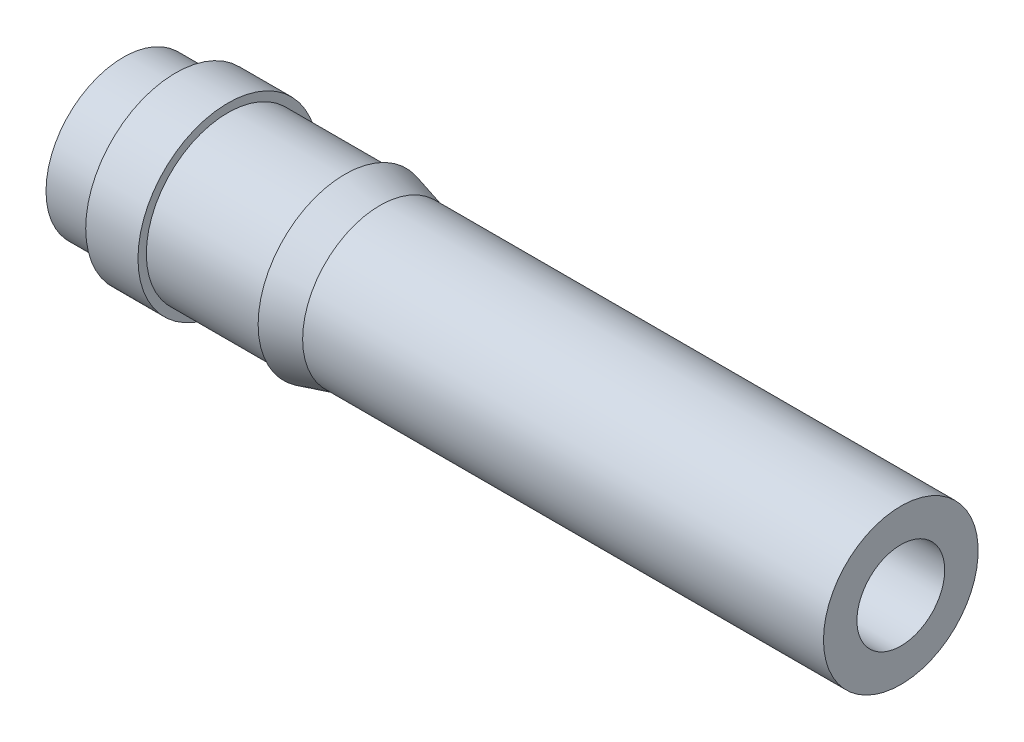
ISO-10303-21;
HEADER;
FILE_DESCRIPTION(('STEP AP214'),'2;1');
FILE_NAME('part.step','',(''),(''),'','','');
FILE_SCHEMA(('AUTOMOTIVE_DESIGN { 1 0 10303 214 1 1 1 1 }'));
ENDSEC;
DATA;
#1=APPLICATION_CONTEXT('core data for automotive mechanical design processes');
#2=APPLICATION_PROTOCOL_DEFINITION('international standard','automotive_design',2000,#1);
#3=PRODUCT_CONTEXT('',#1,'mechanical');
#4=PRODUCT('Part','Part','',(#3));
#5=PRODUCT_RELATED_PRODUCT_CATEGORY('part','',(#4));
#6=PRODUCT_DEFINITION_FORMATION('','',#4);
#7=PRODUCT_DEFINITION_CONTEXT('part definition',#1,'design');
#8=PRODUCT_DEFINITION('design','',#6,#7);
#9=PRODUCT_DEFINITION_SHAPE('','',#8);
#10=(LENGTH_UNIT() NAMED_UNIT(*) SI_UNIT(.MILLI.,.METRE.));
#11=(NAMED_UNIT(*) PLANE_ANGLE_UNIT() SI_UNIT($,.RADIAN.));
#12=(NAMED_UNIT(*) SI_UNIT($,.STERADIAN.) SOLID_ANGLE_UNIT());
#13=UNCERTAINTY_MEASURE_WITH_UNIT(LENGTH_MEASURE(1.E-05),#10,'distance_accuracy_value','');
#14=(GEOMETRIC_REPRESENTATION_CONTEXT(3) GLOBAL_UNCERTAINTY_ASSIGNED_CONTEXT((#13)) GLOBAL_UNIT_ASSIGNED_CONTEXT((#10,
#11,#12)) REPRESENTATION_CONTEXT('',''));
#15=CARTESIAN_POINT('',(0.,0.,0.));
#16=DIRECTION('',(0.,0.,1.));
#17=DIRECTION('',(1.,0.,0.));
#18=AXIS2_PLACEMENT_3D('',#15,#16,#17);
#19=CARTESIAN_POINT('',(0.,0.,0.));
#20=DIRECTION('',(1.,0.,0.));
#21=DIRECTION('',(0.,0.,-1.));
#22=AXIS2_PLACEMENT_3D('',#19,#20,#21);
#23=PLANE('',#22);
#24=CARTESIAN_POINT('',(0.,0.,0.));
#25=DIRECTION('',(-1.,0.,0.));
#26=DIRECTION('',(0.,0.,1.));
#27=AXIS2_PLACEMENT_3D('',#24,#25,#26);
#28=CIRCLE('',#27,0.35052);
#29=CARTESIAN_POINT('',(0.,0.,0.35052));
#30=VERTEX_POINT('',#29);
#31=EDGE_CURVE('E70',#30,#30,#28,.T.);
#32=ORIENTED_EDGE('',*,*,#31,.F.);
#33=EDGE_LOOP('',(#32));
#34=FACE_BOUND('',#33,.T.);
#35=CARTESIAN_POINT('',(0.,0.,0.));
#36=DIRECTION('',(-1.,0.,0.));
#37=DIRECTION('',(0.,0.,1.));
#38=AXIS2_PLACEMENT_3D('',#35,#36,#37);
#39=CIRCLE('',#38,0.469899999999995);
#40=CARTESIAN_POINT('',(0.,0.,0.469899999999995));
#41=VERTEX_POINT('',#40);
#42=EDGE_CURVE('E10',#41,#41,#39,.T.);
#43=ORIENTED_EDGE('',*,*,#42,.T.);
#44=EDGE_LOOP('',(#43));
#45=FACE_BOUND('',#44,.T.);
#46=ADVANCED_FACE('F33',(#34,#45),#23,.F.);
#47=CARTESIAN_POINT('',(0.,0.,0.));
#48=DIRECTION('',(-1.,0.,0.));
#49=DIRECTION('',(0.,0.,1.));
#50=AXIS2_PLACEMENT_3D('',#47,#48,#49);
#51=CYLINDRICAL_SURFACE('',#50,0.469899999999995);
#52=ORIENTED_EDGE('',*,*,#42,.F.);
#53=EDGE_LOOP('',(#52));
#54=FACE_BOUND('',#53,.T.);
#55=CARTESIAN_POINT('',(0.317499999999981,0.,0.));
#56=DIRECTION('',(-1.,0.,0.));
#57=DIRECTION('',(0.,0.,1.));
#58=AXIS2_PLACEMENT_3D('',#55,#56,#57);
#59=CIRCLE('',#58,0.469899999999995);
#60=CARTESIAN_POINT('',(0.317499999999981,0.,0.469899999999995));
#61=VERTEX_POINT('',#60);
#62=EDGE_CURVE('E39',#61,#61,#59,.T.);
#63=ORIENTED_EDGE('',*,*,#62,.T.);
#64=EDGE_LOOP('',(#63));
#65=FACE_BOUND('',#64,.T.);
#66=ADVANCED_FACE('F103',(#54,#65),#51,.T.);
#67=CARTESIAN_POINT('',(0.317500000000001,0.546099999999994,0.));
#68=DIRECTION('',(1.,0.,0.));
#69=DIRECTION('',(0.,0.,-1.));
#70=AXIS2_PLACEMENT_3D('',#67,#68,#69);
#71=PLANE('',#70);
#72=ORIENTED_EDGE('',*,*,#62,.F.);
#73=EDGE_LOOP('',(#72));
#74=FACE_BOUND('',#73,.T.);
#75=CARTESIAN_POINT('',(0.317500000000021,0.,0.));
#76=DIRECTION('',(-1.,0.,0.));
#77=DIRECTION('',(0.,0.,1.));
#78=AXIS2_PLACEMENT_3D('',#75,#76,#77);
#79=CIRCLE('',#78,0.546099999999994);
#80=CARTESIAN_POINT('',(0.317500000000021,0.,0.546099999999994));
#81=VERTEX_POINT('',#80);
#82=EDGE_CURVE('E43',#81,#81,#79,.T.);
#83=ORIENTED_EDGE('',*,*,#82,.T.);
#84=EDGE_LOOP('',(#83));
#85=FACE_BOUND('',#84,.T.);
#86=ADVANCED_FACE('F108',(#74,#85),#71,.F.);
#87=CARTESIAN_POINT('',(0.,0.,0.));
#88=DIRECTION('',(-1.,0.,0.));
#89=DIRECTION('',(0.,0.,1.));
#90=AXIS2_PLACEMENT_3D('',#87,#88,#89);
#91=CYLINDRICAL_SURFACE('',#90,0.546099999999993);
#92=ORIENTED_EDGE('',*,*,#82,.F.);
#93=EDGE_LOOP('',(#92));
#94=FACE_BOUND('',#93,.T.);
#95=CARTESIAN_POINT('',(0.635,0.,0.));
#96=DIRECTION('',(-1.,0.,0.));
#97=DIRECTION('',(0.,0.,1.));
#98=AXIS2_PLACEMENT_3D('',#95,#96,#97);
#99=CIRCLE('',#98,0.546099999999993);
#100=CARTESIAN_POINT('',(0.635,0.,0.546099999999993));
#101=VERTEX_POINT('',#100);
#102=EDGE_CURVE('E47',#101,#101,#99,.T.);
#103=ORIENTED_EDGE('',*,*,#102,.T.);
#104=EDGE_LOOP('',(#103));
#105=FACE_BOUND('',#104,.T.);
#106=ADVANCED_FACE('F182',(#94,#105),#91,.T.);
#107=CARTESIAN_POINT('',(0.635,0.546099999999993,0.));
#108=DIRECTION('',(-1.,0.,0.));
#109=DIRECTION('',(0.,0.,1.));
#110=AXIS2_PLACEMENT_3D('',#107,#108,#109);
#111=PLANE('',#110);
#112=ORIENTED_EDGE('',*,*,#102,.F.);
#113=EDGE_LOOP('',(#112));
#114=FACE_BOUND('',#113,.T.);
#115=CARTESIAN_POINT('',(0.635,0.,0.));
#116=DIRECTION('',(-1.,0.,0.));
#117=DIRECTION('',(0.,0.,1.));
#118=AXIS2_PLACEMENT_3D('',#115,#116,#117);
#119=CIRCLE('',#118,0.495299999999976);
#120=CARTESIAN_POINT('',(0.635,0.,0.495299999999976));
#121=VERTEX_POINT('',#120);
#122=EDGE_CURVE('E52',#121,#121,#119,.T.);
#123=ORIENTED_EDGE('',*,*,#122,.T.);
#124=EDGE_LOOP('',(#123));
#125=FACE_BOUND('',#124,.T.);
#126=ADVANCED_FACE('F172',(#114,#125),#111,.F.);
#127=CARTESIAN_POINT('',(0.,0.,0.));
#128=DIRECTION('',(-1.,0.,0.));
#129=DIRECTION('',(0.,0.,1.));
#130=AXIS2_PLACEMENT_3D('',#127,#128,#129);
#131=CYLINDRICAL_SURFACE('',#130,0.495299999999976);
#132=ORIENTED_EDGE('',*,*,#122,.F.);
#133=EDGE_LOOP('',(#132));
#134=FACE_BOUND('',#133,.T.);
#135=CARTESIAN_POINT('',(1.34619999999997,0.,0.));
#136=DIRECTION('',(-1.,0.,0.));
#137=DIRECTION('',(0.,0.,1.));
#138=AXIS2_PLACEMENT_3D('',#135,#136,#137);
#139=CIRCLE('',#138,0.495299999999976);
#140=CARTESIAN_POINT('',(1.34619999999997,0.,0.495299999999976));
#141=VERTEX_POINT('',#140);
#142=EDGE_CURVE('E55',#141,#141,#139,.T.);
#143=ORIENTED_EDGE('',*,*,#142,.T.);
#144=EDGE_LOOP('',(#143));
#145=FACE_BOUND('',#144,.T.);
#146=ADVANCED_FACE('F162',(#134,#145),#131,.T.);
#147=CARTESIAN_POINT('',(1.34619999999997,0.495299999999976,0.));
#148=DIRECTION('',(1.,0.,0.));
#149=DIRECTION('',(0.,0.,-1.));
#150=AXIS2_PLACEMENT_3D('',#147,#148,#149);
#151=PLANE('',#150);
#152=ORIENTED_EDGE('',*,*,#142,.F.);
#153=EDGE_LOOP('',(#152));
#154=FACE_BOUND('',#153,.T.);
#155=CARTESIAN_POINT('',(1.34619999999997,0.,0.));
#156=DIRECTION('',(-1.,0.,0.));
#157=DIRECTION('',(0.,0.,1.));
#158=AXIS2_PLACEMENT_3D('',#155,#156,#157);
#159=CIRCLE('',#158,0.527049999999958);
#160=CARTESIAN_POINT('',(1.34619999999997,0.,0.527049999999958));
#161=VERTEX_POINT('',#160);
#162=EDGE_CURVE('E58',#161,#161,#159,.T.);
#163=ORIENTED_EDGE('',*,*,#162,.T.);
#164=EDGE_LOOP('',(#163));
#165=FACE_BOUND('',#164,.T.);
#166=ADVANCED_FACE('F98',(#154,#165),#151,.F.);
#167=CARTESIAN_POINT('',(1.55948670365232,0.,0.));
#168=DIRECTION('',(-1.,0.,0.));
#169=DIRECTION('',(0.,0.,1.));
#170=AXIS2_PLACEMENT_3D('',#167,#168,#169);
#171=CONICAL_SURFACE('',#170,0.469899999999995,0.261799387799234);
#172=ORIENTED_EDGE('',*,*,#162,.F.);
#173=EDGE_LOOP('',(#172));
#174=FACE_BOUND('',#173,.T.);
#175=CARTESIAN_POINT('',(1.55948670365232,0.,0.));
#176=DIRECTION('',(-1.,0.,0.));
#177=DIRECTION('',(0.,0.,1.));
#178=AXIS2_PLACEMENT_3D('',#175,#176,#177);
#179=CIRCLE('',#178,0.469899999999995);
#180=CARTESIAN_POINT('',(1.55948670365232,0.,0.469899999999995));
#181=VERTEX_POINT('',#180);
#182=EDGE_CURVE('E61',#181,#181,#179,.T.);
#183=ORIENTED_EDGE('',*,*,#182,.T.);
#184=EDGE_LOOP('',(#183));
#185=FACE_BOUND('',#184,.T.);
#186=ADVANCED_FACE('F92',(#174,#185),#171,.T.);
#187=CARTESIAN_POINT('',(0.,0.,0.));
#188=DIRECTION('',(-1.,0.,0.));
#189=DIRECTION('',(0.,0.,1.));
#190=AXIS2_PLACEMENT_3D('',#187,#188,#189);
#191=CYLINDRICAL_SURFACE('',#190,0.469899999999995);
#192=ORIENTED_EDGE('',*,*,#182,.F.);
#193=EDGE_LOOP('',(#192));
#194=FACE_BOUND('',#193,.T.);
#195=CARTESIAN_POINT('',(4.7244,0.,0.));
#196=DIRECTION('',(-1.,0.,0.));
#197=DIRECTION('',(0.,0.,1.));
#198=AXIS2_PLACEMENT_3D('',#195,#196,#197);
#199=CIRCLE('',#198,0.469899999999995);
#200=CARTESIAN_POINT('',(4.7244,0.,0.469899999999995));
#201=VERTEX_POINT('',#200);
#202=EDGE_CURVE('E64',#201,#201,#199,.T.);
#203=ORIENTED_EDGE('',*,*,#202,.T.);
#204=EDGE_LOOP('',(#203));
#205=FACE_BOUND('',#204,.T.);
#206=ADVANCED_FACE('F87',(#194,#205),#191,.T.);
#207=CARTESIAN_POINT('',(4.7244,0.469899999999995,0.));
#208=DIRECTION('',(-1.,0.,0.));
#209=DIRECTION('',(0.,0.,1.));
#210=AXIS2_PLACEMENT_3D('',#207,#208,#209);
#211=PLANE('',#210);
#212=CARTESIAN_POINT('',(4.7244,0.,0.));
#213=DIRECTION('',(1.,0.,0.));
#214=DIRECTION('',(0.,0.,-1.));
#215=AXIS2_PLACEMENT_3D('',#212,#213,#214);
#216=CIRCLE('',#215,0.2667);
#217=CARTESIAN_POINT('',(4.7244,0.,-0.2667));
#218=VERTEX_POINT('',#217);
#219=EDGE_CURVE('E76',#218,#218,#216,.T.);
#220=ORIENTED_EDGE('',*,*,#219,.F.);
#221=EDGE_LOOP('',(#220));
#222=FACE_BOUND('',#221,.T.);
#223=ORIENTED_EDGE('',*,*,#202,.F.);
#224=EDGE_LOOP('',(#223));
#225=FACE_BOUND('',#224,.T.);
#226=ADVANCED_FACE('F83',(#222,#225),#211,.F.);
#227=CARTESIAN_POINT('',(3.937,0.,0.));
#228=DIRECTION('',(-1.,0.,0.));
#229=DIRECTION('',(0.,0.,1.));
#230=AXIS2_PLACEMENT_3D('',#227,#228,#229);
#231=CONICAL_SURFACE('',#230,0.350519999999999,1.02974425867666);
#232=CARTESIAN_POINT('',(3.98736413708689,0.,0.));
#233=DIRECTION('',(-1.,0.,0.));
#234=DIRECTION('',(0.,0.,1.));
#235=AXIS2_PLACEMENT_3D('',#232,#233,#234);
#236=CIRCLE('',#235,0.2667);
#237=CARTESIAN_POINT('',(3.98736413708689,0.,0.2667));
#238=VERTEX_POINT('',#237);
#239=EDGE_CURVE('E73',#238,#238,#236,.F.);
#240=ORIENTED_EDGE('',*,*,#239,.T.);
#241=EDGE_LOOP('',(#240));
#242=FACE_BOUND('',#241,.T.);
#243=CARTESIAN_POINT('',(3.937,0.,0.));
#244=DIRECTION('',(-1.,0.,0.));
#245=DIRECTION('',(0.,0.,1.));
#246=AXIS2_PLACEMENT_3D('',#243,#244,#245);
#247=CIRCLE('',#246,0.350519999999999);
#248=CARTESIAN_POINT('',(3.937,0.,0.350519999999999));
#249=VERTEX_POINT('',#248);
#250=EDGE_CURVE('E67',#249,#249,#247,.T.);
#251=ORIENTED_EDGE('',*,*,#250,.T.);
#252=EDGE_LOOP('',(#251));
#253=FACE_BOUND('',#252,.T.);
#254=ADVANCED_FACE('F86',(#242,#253),#231,.F.);
#255=CARTESIAN_POINT('',(0.,0.,0.));
#256=DIRECTION('',(-1.,0.,0.));
#257=DIRECTION('',(0.,0.,1.));
#258=AXIS2_PLACEMENT_3D('',#255,#256,#257);
#259=CYLINDRICAL_SURFACE('',#258,0.35052);
#260=ORIENTED_EDGE('',*,*,#250,.F.);
#261=EDGE_LOOP('',(#260));
#262=FACE_BOUND('',#261,.T.);
#263=ORIENTED_EDGE('',*,*,#31,.T.);
#264=EDGE_LOOP('',(#263));
#265=FACE_BOUND('',#264,.T.);
#266=ADVANCED_FACE('F112',(#262,#265),#259,.F.);
#267=CARTESIAN_POINT('',(4.7244,0.,0.));
#268=DIRECTION('',(1.,0.,0.));
#269=DIRECTION('',(0.,0.,-1.));
#270=AXIS2_PLACEMENT_3D('',#267,#268,#269);
#271=CYLINDRICAL_SURFACE('',#270,0.2667);
#272=ORIENTED_EDGE('',*,*,#219,.T.);
#273=EDGE_LOOP('',(#272));
#274=FACE_BOUND('',#273,.T.);
#275=ORIENTED_EDGE('',*,*,#239,.F.);
#276=EDGE_LOOP('',(#275));
#277=FACE_BOUND('',#276,.T.);
#278=ADVANCED_FACE('F80',(#274,#277),#271,.F.);
#279=CLOSED_SHELL('',(#46,#66,#86,#106,#126,#146,#166,#186,#206,#226,#254,#266,#278));
#280=MANIFOLD_SOLID_BREP('B2',#279);
#281=ADVANCED_BREP_SHAPE_REPRESENTATION('',(#18,#280),#14);
#282=SHAPE_DEFINITION_REPRESENTATION(#9,#281);
ENDSEC;
END-ISO-10303-21;
